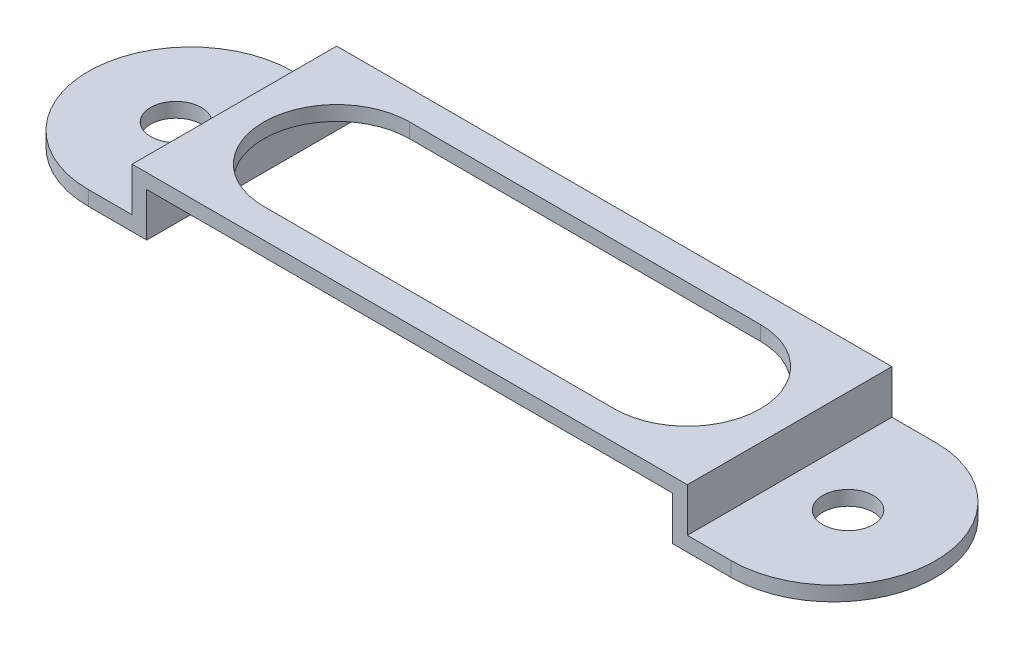
ISO-10303-21;
HEADER;
FILE_DESCRIPTION(('STEP AP214'),'2;1');
FILE_NAME('part.step','',(''),(''),'','','');
FILE_SCHEMA(('AUTOMOTIVE_DESIGN { 1 0 10303 214 1 1 1 1 }'));
ENDSEC;
DATA;
#1=APPLICATION_CONTEXT('core data for automotive mechanical design processes');
#2=APPLICATION_PROTOCOL_DEFINITION('international standard','automotive_design',2000,#1);
#3=PRODUCT_CONTEXT('',#1,'mechanical');
#4=PRODUCT('Part','Part','',(#3));
#5=PRODUCT_RELATED_PRODUCT_CATEGORY('part','',(#4));
#6=PRODUCT_DEFINITION_FORMATION('','',#4);
#7=PRODUCT_DEFINITION_CONTEXT('part definition',#1,'design');
#8=PRODUCT_DEFINITION('design','',#6,#7);
#9=PRODUCT_DEFINITION_SHAPE('','',#8);
#10=(LENGTH_UNIT() NAMED_UNIT(*) SI_UNIT(.MILLI.,.METRE.));
#11=(NAMED_UNIT(*) PLANE_ANGLE_UNIT() SI_UNIT($,.RADIAN.));
#12=(NAMED_UNIT(*) SI_UNIT($,.STERADIAN.) SOLID_ANGLE_UNIT());
#13=UNCERTAINTY_MEASURE_WITH_UNIT(LENGTH_MEASURE(1.E-05),#10,'distance_accuracy_value','');
#14=(GEOMETRIC_REPRESENTATION_CONTEXT(3) GLOBAL_UNCERTAINTY_ASSIGNED_CONTEXT((#13)) GLOBAL_UNIT_ASSIGNED_CONTEXT((#10,
#11,#12)) REPRESENTATION_CONTEXT('',''));
#15=CARTESIAN_POINT('',(0.,0.,0.));
#16=DIRECTION('',(0.,0.,1.));
#17=DIRECTION('',(1.,0.,0.));
#18=AXIS2_PLACEMENT_3D('',#15,#16,#17);
#19=CARTESIAN_POINT('',(0.,0.,0.));
#20=DIRECTION('',(0.,1.,0.));
#21=DIRECTION('',(0.,0.,1.));
#22=AXIS2_PLACEMENT_3D('',#19,#20,#21);
#23=PLANE('',#22);
#24=CARTESIAN_POINT('',(71.4375,0.,0.));
#25=DIRECTION('',(0.,1.,0.));
#26=DIRECTION('',(0.,0.,1.));
#27=AXIS2_PLACEMENT_3D('',#24,#25,#26);
#28=CIRCLE('',#27,2.75);
#29=CARTESIAN_POINT('',(71.4375,0.,2.75));
#30=VERTEX_POINT('',#29);
#31=EDGE_CURVE('E171',#30,#30,#28,.T.);
#32=ORIENTED_EDGE('',*,*,#31,.T.);
#33=EDGE_LOOP('',(#32));
#34=FACE_BOUND('',#33,.T.);
#35=DIRECTION('',(1.,0.,0.));
#36=VECTOR('',#35,1.);
#37=CARTESIAN_POINT('',(0.,0.,11.1125));
#38=LINE('',#37,#36);
#39=CARTESIAN_POINT('',(63.5,0.,11.1125));
#40=VERTEX_POINT('',#39);
#41=CARTESIAN_POINT('',(69.85,0.,11.1125));
#42=VERTEX_POINT('',#41);
#43=EDGE_CURVE('E253',#40,#42,#38,.T.);
#44=ORIENTED_EDGE('',*,*,#43,.F.);
#45=DIRECTION('',(0.,0.,-1.));
#46=VECTOR('',#45,1.);
#47=CARTESIAN_POINT('',(63.5,0.,11.1125));
#48=LINE('',#47,#46);
#49=CARTESIAN_POINT('',(63.5,0.,-11.1125));
#50=VERTEX_POINT('',#49);
#51=EDGE_CURVE('E205',#40,#50,#48,.T.);
#52=ORIENTED_EDGE('',*,*,#51,.T.);
#53=DIRECTION('',(-1.,0.,0.));
#54=VECTOR('',#53,1.);
#55=CARTESIAN_POINT('',(0.,0.,-11.1125));
#56=LINE('',#55,#54);
#57=CARTESIAN_POINT('',(69.85,0.,-11.1125));
#58=VERTEX_POINT('',#57);
#59=EDGE_CURVE('E247',#58,#50,#56,.T.);
#60=ORIENTED_EDGE('',*,*,#59,.F.);
#61=CARTESIAN_POINT('',(69.85,0.,0.));
#62=DIRECTION('',(0.,1.,0.));
#63=DIRECTION('',(0.,0.,1.));
#64=AXIS2_PLACEMENT_3D('',#61,#62,#63);
#65=CIRCLE('',#64,11.1125);
#66=EDGE_CURVE('E257',#42,#58,#65,.T.);
#67=ORIENTED_EDGE('',*,*,#66,.F.);
#68=EDGE_LOOP('',(#44,#52,#60,#67));
#69=FACE_BOUND('',#68,.T.);
#70=ADVANCED_FACE('F33',(#34,#69),#23,.F.);
#71=CARTESIAN_POINT('',(0.,6.35,0.));
#72=DIRECTION('',(0.,1.,0.));
#73=DIRECTION('',(0.,0.,1.));
#74=AXIS2_PLACEMENT_3D('',#71,#72,#73);
#75=PLANE('',#74);
#76=DIRECTION('',(0.,0.,-1.));
#77=VECTOR('',#76,1.);
#78=CARTESIAN_POINT('',(4.76249999999998,6.35,11.1125));
#79=LINE('',#78,#77);
#80=CARTESIAN_POINT('',(4.76249999999998,6.35,11.1125));
#81=VERTEX_POINT('',#80);
#82=CARTESIAN_POINT('',(4.76249999999999,6.35,-11.1125));
#83=VERTEX_POINT('',#82);
#84=EDGE_CURVE('E55',#81,#83,#79,.T.);
#85=ORIENTED_EDGE('',*,*,#84,.F.);
#86=DIRECTION('',(1.,0.,0.));
#87=VECTOR('',#86,1.);
#88=CARTESIAN_POINT('',(0.,6.35,11.1125));
#89=LINE('',#88,#87);
#90=CARTESIAN_POINT('',(65.0875,6.35,11.1125));
#91=VERTEX_POINT('',#90);
#92=EDGE_CURVE('E244',#81,#91,#89,.T.);
#93=ORIENTED_EDGE('',*,*,#92,.T.);
#94=DIRECTION('',(0.,0.,-1.));
#95=VECTOR('',#94,1.);
#96=CARTESIAN_POINT('',(65.0875,6.35,11.1125));
#97=LINE('',#96,#95);
#98=CARTESIAN_POINT('',(65.0875,6.35,-11.1125));
#99=VERTEX_POINT('',#98);
#100=EDGE_CURVE('E152',#91,#99,#97,.T.);
#101=ORIENTED_EDGE('',*,*,#100,.T.);
#102=DIRECTION('',(-1.,0.,0.));
#103=VECTOR('',#102,1.);
#104=CARTESIAN_POINT('',(0.,6.35,-11.1125));
#105=LINE('',#104,#103);
#106=EDGE_CURVE('E246',#99,#83,#105,.T.);
#107=ORIENTED_EDGE('',*,*,#106,.T.);
#108=EDGE_LOOP('',(#85,#93,#101,#107));
#109=FACE_BOUND('',#108,.T.);
#110=DIRECTION('',(1.,0.,0.));
#111=VECTOR('',#110,1.);
#112=CARTESIAN_POINT('',(15.875,6.35,7.9375));
#113=LINE('',#112,#111);
#114=CARTESIAN_POINT('',(15.875,6.35,7.9375));
#115=VERTEX_POINT('',#114);
#116=CARTESIAN_POINT('',(53.975,6.35,7.9375));
#117=VERTEX_POINT('',#116);
#118=EDGE_CURVE('E224',#115,#117,#113,.T.);
#119=ORIENTED_EDGE('',*,*,#118,.F.);
#120=CARTESIAN_POINT('',(15.875,6.35,0.));
#121=DIRECTION('',(0.,1.,0.));
#122=DIRECTION('',(0.,0.,1.));
#123=AXIS2_PLACEMENT_3D('',#120,#121,#122);
#124=CIRCLE('',#123,7.9375);
#125=CARTESIAN_POINT('',(15.875,6.35,-7.9375));
#126=VERTEX_POINT('',#125);
#127=EDGE_CURVE('E222',#126,#115,#124,.T.);
#128=ORIENTED_EDGE('',*,*,#127,.F.);
#129=DIRECTION('',(-1.,0.,0.));
#130=VECTOR('',#129,1.);
#131=CARTESIAN_POINT('',(15.875,6.35,-7.9375));
#132=LINE('',#131,#130);
#133=CARTESIAN_POINT('',(53.975,6.35,-7.93750000000001));
#134=VERTEX_POINT('',#133);
#135=EDGE_CURVE('E229',#134,#126,#132,.T.);
#136=ORIENTED_EDGE('',*,*,#135,.F.);
#137=CARTESIAN_POINT('',(53.975,6.35,0.));
#138=DIRECTION('',(0.,1.,0.));
#139=DIRECTION('',(0.,0.,1.));
#140=AXIS2_PLACEMENT_3D('',#137,#138,#139);
#141=CIRCLE('',#140,7.9375);
#142=EDGE_CURVE('E226',#117,#134,#141,.T.);
#143=ORIENTED_EDGE('',*,*,#142,.F.);
#144=EDGE_LOOP('',(#119,#128,#136,#143));
#145=FACE_BOUND('',#144,.T.);
#146=ADVANCED_FACE('F286',(#109,#145),#75,.T.);
#147=CARTESIAN_POINT('',(-1.5875,0.,0.));
#148=DIRECTION('',(0.,1.,0.));
#149=DIRECTION('',(0.,0.,1.));
#150=AXIS2_PLACEMENT_3D('',#147,#148,#149);
#151=CIRCLE('',#150,2.75);
#152=CARTESIAN_POINT('',(-1.5875,0.,2.75));
#153=VERTEX_POINT('',#152);
#154=EDGE_CURVE('E322',#153,#153,#151,.T.);
#155=ORIENTED_EDGE('',*,*,#154,.T.);
#156=EDGE_LOOP('',(#155));
#157=FACE_BOUND('',#156,.T.);
#158=CARTESIAN_POINT('',(6.34999999999999,0.,-11.1125));
#159=VERTEX_POINT('',#158);
#160=CARTESIAN_POINT('',(0.,0.,-11.1125));
#161=VERTEX_POINT('',#160);
#162=EDGE_CURVE('E260',#159,#161,#56,.T.);
#163=ORIENTED_EDGE('',*,*,#162,.F.);
#164=DIRECTION('',(0.,0.,-1.));
#165=VECTOR('',#164,1.);
#166=CARTESIAN_POINT('',(6.34999999999999,0.,11.1125));
#167=LINE('',#166,#165);
#168=CARTESIAN_POINT('',(6.34999999999999,0.,11.1125));
#169=VERTEX_POINT('',#168);
#170=EDGE_CURVE('E198',#169,#159,#167,.T.);
#171=ORIENTED_EDGE('',*,*,#170,.F.);
#172=CARTESIAN_POINT('',(0.,0.,11.1125));
#173=VERTEX_POINT('',#172);
#174=EDGE_CURVE('E254',#173,#169,#38,.T.);
#175=ORIENTED_EDGE('',*,*,#174,.F.);
#176=CARTESIAN_POINT('',(0.,0.,0.));
#177=DIRECTION('',(0.,1.,0.));
#178=DIRECTION('',(0.,0.,1.));
#179=AXIS2_PLACEMENT_3D('',#176,#177,#178);
#180=CIRCLE('',#179,11.1125);
#181=EDGE_CURVE('E243',#161,#173,#180,.T.);
#182=ORIENTED_EDGE('',*,*,#181,.F.);
#183=EDGE_LOOP('',(#163,#171,#175,#182));
#184=FACE_BOUND('',#183,.T.);
#185=ADVANCED_FACE('F304',(#157,#184),#23,.F.);
#186=CARTESIAN_POINT('',(0.,6.35,0.));
#187=DIRECTION('',(0.,-1.,0.));
#188=DIRECTION('',(0.,0.,-1.));
#189=AXIS2_PLACEMENT_3D('',#186,#187,#188);
#190=CYLINDRICAL_SURFACE('',#189,11.1125);
#191=DIRECTION('',(0.,-1.,0.));
#192=VECTOR('',#191,1.);
#193=CARTESIAN_POINT('',(0.,6.35,11.1125));
#194=LINE('',#193,#192);
#195=CARTESIAN_POINT('',(0.,1.5875,11.1125));
#196=VERTEX_POINT('',#195);
#197=EDGE_CURVE('E267',#196,#173,#194,.T.);
#198=ORIENTED_EDGE('',*,*,#197,.F.);
#199=CARTESIAN_POINT('',(0.,1.5875,0.));
#200=DIRECTION('',(0.,-1.,0.));
#201=DIRECTION('',(0.,0.,-1.));
#202=AXIS2_PLACEMENT_3D('',#199,#200,#201);
#203=CIRCLE('',#202,11.1125);
#204=CARTESIAN_POINT('',(0.,1.5875,-11.1125));
#205=VERTEX_POINT('',#204);
#206=EDGE_CURVE('E220',#196,#205,#203,.T.);
#207=ORIENTED_EDGE('',*,*,#206,.T.);
#208=DIRECTION('',(0.,-1.,0.));
#209=VECTOR('',#208,1.);
#210=CARTESIAN_POINT('',(0.,6.35,-11.1125));
#211=LINE('',#210,#209);
#212=EDGE_CURVE('E250',#205,#161,#211,.T.);
#213=ORIENTED_EDGE('',*,*,#212,.T.);
#214=ORIENTED_EDGE('',*,*,#181,.T.);
#215=EDGE_LOOP('',(#198,#207,#213,#214));
#216=FACE_BOUND('',#215,.T.);
#217=ADVANCED_FACE('F35',(#216),#190,.T.);
#218=CARTESIAN_POINT('',(0.,6.35,11.1125));
#219=DIRECTION('',(0.,0.,-1.));
#220=DIRECTION('',(-1.,0.,0.));
#221=AXIS2_PLACEMENT_3D('',#218,#219,#220);
#222=PLANE('',#221);
#223=DIRECTION('',(0.,-1.,0.));
#224=VECTOR('',#223,1.);
#225=CARTESIAN_POINT('',(4.76249999999998,6.35,11.1125));
#226=LINE('',#225,#224);
#227=CARTESIAN_POINT('',(4.76249999999999,1.5875,11.1125));
#228=VERTEX_POINT('',#227);
#229=EDGE_CURVE('E176',#81,#228,#226,.T.);
#230=ORIENTED_EDGE('',*,*,#229,.T.);
#231=DIRECTION('',(-1.,0.,0.));
#232=VECTOR('',#231,1.);
#233=CARTESIAN_POINT('',(4.76249999999999,1.5875,11.1125));
#234=LINE('',#233,#232);
#235=EDGE_CURVE('E178',#228,#196,#234,.T.);
#236=ORIENTED_EDGE('',*,*,#235,.T.);
#237=ORIENTED_EDGE('',*,*,#197,.T.);
#238=ORIENTED_EDGE('',*,*,#174,.T.);
#239=DIRECTION('',(0.,1.,0.));
#240=VECTOR('',#239,1.);
#241=CARTESIAN_POINT('',(6.34999999999999,0.,11.1125));
#242=LINE('',#241,#240);
#243=CARTESIAN_POINT('',(6.34999999999999,4.7625,11.1125));
#244=VERTEX_POINT('',#243);
#245=EDGE_CURVE('E188',#169,#244,#242,.T.);
#246=ORIENTED_EDGE('',*,*,#245,.T.);
#247=DIRECTION('',(1.,0.,0.));
#248=VECTOR('',#247,1.);
#249=CARTESIAN_POINT('',(6.34999999999999,4.7625,11.1125));
#250=LINE('',#249,#248);
#251=CARTESIAN_POINT('',(63.5,4.76249999999999,11.1125));
#252=VERTEX_POINT('',#251);
#253=EDGE_CURVE('E191',#244,#252,#250,.T.);
#254=ORIENTED_EDGE('',*,*,#253,.T.);
#255=DIRECTION('',(0.,-1.,0.));
#256=VECTOR('',#255,1.);
#257=CARTESIAN_POINT('',(63.5,4.76249999999999,11.1125));
#258=LINE('',#257,#256);
#259=EDGE_CURVE('E195',#252,#40,#258,.T.);
#260=ORIENTED_EDGE('',*,*,#259,.T.);
#261=ORIENTED_EDGE('',*,*,#43,.T.);
#262=DIRECTION('',(0.,-1.,0.));
#263=VECTOR('',#262,1.);
#264=CARTESIAN_POINT('',(69.85,6.35,11.1125));
#265=LINE('',#264,#263);
#266=CARTESIAN_POINT('',(69.85,1.5875,11.1125));
#267=VERTEX_POINT('',#266);
#268=EDGE_CURVE('E165',#267,#42,#265,.T.);
#269=ORIENTED_EDGE('',*,*,#268,.F.);
#270=DIRECTION('',(-1.,0.,0.));
#271=VECTOR('',#270,1.);
#272=CARTESIAN_POINT('',(80.9625,1.5875,11.1125));
#273=LINE('',#272,#271);
#274=CARTESIAN_POINT('',(65.0875,1.5875,11.1125));
#275=VERTEX_POINT('',#274);
#276=EDGE_CURVE('E148',#267,#275,#273,.T.);
#277=ORIENTED_EDGE('',*,*,#276,.T.);
#278=DIRECTION('',(0.,1.,0.));
#279=VECTOR('',#278,1.);
#280=CARTESIAN_POINT('',(65.0875,1.5875,11.1125));
#281=LINE('',#280,#279);
#282=EDGE_CURVE('E153',#275,#91,#281,.T.);
#283=ORIENTED_EDGE('',*,*,#282,.T.);
#284=ORIENTED_EDGE('',*,*,#92,.F.);
#285=EDGE_LOOP('',(#230,#236,#237,#238,#246,#254,#260,#261,#269,#277,#283,#284));
#286=FACE_BOUND('',#285,.T.);
#287=ADVANCED_FACE('F163',(#286),#222,.F.);
#288=CARTESIAN_POINT('',(69.85,6.35,0.));
#289=DIRECTION('',(0.,-1.,0.));
#290=DIRECTION('',(0.,0.,-1.));
#291=AXIS2_PLACEMENT_3D('',#288,#289,#290);
#292=CYLINDRICAL_SURFACE('',#291,11.1125);
#293=CARTESIAN_POINT('',(69.85,1.5875,0.));
#294=DIRECTION('',(0.,-1.,0.));
#295=DIRECTION('',(1.,0.,0.));
#296=AXIS2_PLACEMENT_3D('',#293,#294,#295);
#297=CIRCLE('',#296,11.1125);
#298=CARTESIAN_POINT('',(69.85,1.5875,-11.1125));
#299=VERTEX_POINT('',#298);
#300=EDGE_CURVE('E48',#299,#267,#297,.T.);
#301=ORIENTED_EDGE('',*,*,#300,.T.);
#302=ORIENTED_EDGE('',*,*,#268,.T.);
#303=ORIENTED_EDGE('',*,*,#66,.T.);
#304=DIRECTION('',(0.,-1.,0.));
#305=VECTOR('',#304,1.);
#306=CARTESIAN_POINT('',(69.85,6.35,-11.1125));
#307=LINE('',#306,#305);
#308=EDGE_CURVE('E264',#299,#58,#307,.T.);
#309=ORIENTED_EDGE('',*,*,#308,.F.);
#310=EDGE_LOOP('',(#301,#302,#303,#309));
#311=FACE_BOUND('',#310,.T.);
#312=ADVANCED_FACE('F471',(#311),#292,.T.);
#313=CARTESIAN_POINT('',(0.,6.35,-11.1125));
#314=DIRECTION('',(0.,0.,1.));
#315=DIRECTION('',(1.,0.,0.));
#316=AXIS2_PLACEMENT_3D('',#313,#314,#315);
#317=PLANE('',#316);
#318=ORIENTED_EDGE('',*,*,#212,.F.);
#319=DIRECTION('',(-1.,0.,0.));
#320=VECTOR('',#319,1.);
#321=CARTESIAN_POINT('',(4.76249999999999,1.5875,-11.1125));
#322=LINE('',#321,#320);
#323=CARTESIAN_POINT('',(4.76249999999999,1.5875,-11.1125));
#324=VERTEX_POINT('',#323);
#325=EDGE_CURVE('E179',#324,#205,#322,.T.);
#326=ORIENTED_EDGE('',*,*,#325,.F.);
#327=DIRECTION('',(0.,-1.,0.));
#328=VECTOR('',#327,1.);
#329=CARTESIAN_POINT('',(4.76249999999998,6.35,-11.1125));
#330=LINE('',#329,#328);
#331=EDGE_CURVE('E182',#83,#324,#330,.T.);
#332=ORIENTED_EDGE('',*,*,#331,.F.);
#333=ORIENTED_EDGE('',*,*,#106,.F.);
#334=DIRECTION('',(0.,1.,0.));
#335=VECTOR('',#334,1.);
#336=CARTESIAN_POINT('',(65.0875,1.5875,-11.1125));
#337=LINE('',#336,#335);
#338=CARTESIAN_POINT('',(65.0875,1.5875,-11.1125));
#339=VERTEX_POINT('',#338);
#340=EDGE_CURVE('E166',#339,#99,#337,.T.);
#341=ORIENTED_EDGE('',*,*,#340,.F.);
#342=DIRECTION('',(1.,0.,0.));
#343=VECTOR('',#342,1.);
#344=CARTESIAN_POINT('',(0.,1.5875,-11.1125));
#345=LINE('',#344,#343);
#346=EDGE_CURVE('E11',#339,#299,#345,.T.);
#347=ORIENTED_EDGE('',*,*,#346,.T.);
#348=ORIENTED_EDGE('',*,*,#308,.T.);
#349=ORIENTED_EDGE('',*,*,#59,.T.);
#350=DIRECTION('',(0.,-1.,0.));
#351=VECTOR('',#350,1.);
#352=CARTESIAN_POINT('',(63.5,4.76249999999999,-11.1125));
#353=LINE('',#352,#351);
#354=CARTESIAN_POINT('',(63.5,4.76249999999999,-11.1125));
#355=VERTEX_POINT('',#354);
#356=EDGE_CURVE('E192',#355,#50,#353,.T.);
#357=ORIENTED_EDGE('',*,*,#356,.F.);
#358=DIRECTION('',(1.,0.,0.));
#359=VECTOR('',#358,1.);
#360=CARTESIAN_POINT('',(6.34999999999999,4.7625,-11.1125));
#361=LINE('',#360,#359);
#362=CARTESIAN_POINT('',(6.34999999999999,4.7625,-11.1125));
#363=VERTEX_POINT('',#362);
#364=EDGE_CURVE('E201',#363,#355,#361,.T.);
#365=ORIENTED_EDGE('',*,*,#364,.F.);
#366=DIRECTION('',(0.,1.,0.));
#367=VECTOR('',#366,1.);
#368=CARTESIAN_POINT('',(6.34999999999999,0.,-11.1125));
#369=LINE('',#368,#367);
#370=EDGE_CURVE('E174',#159,#363,#369,.T.);
#371=ORIENTED_EDGE('',*,*,#370,.F.);
#372=ORIENTED_EDGE('',*,*,#162,.T.);
#373=EDGE_LOOP('',(#318,#326,#332,#333,#341,#347,#348,#349,#357,#365,#371,#372));
#374=FACE_BOUND('',#373,.T.);
#375=ADVANCED_FACE('F331',(#374),#317,.F.);
#376=CARTESIAN_POINT('',(15.875,6.35,0.));
#377=DIRECTION('',(0.,-1.,0.));
#378=DIRECTION('',(0.,0.,-1.));
#379=AXIS2_PLACEMENT_3D('',#376,#377,#378);
#380=CYLINDRICAL_SURFACE('',#379,7.9375);
#381=CARTESIAN_POINT('',(15.875,4.7625,0.));
#382=DIRECTION('',(0.,1.,0.));
#383=DIRECTION('',(-1.,0.,0.));
#384=AXIS2_PLACEMENT_3D('',#381,#382,#383);
#385=CIRCLE('',#384,7.9375);
#386=CARTESIAN_POINT('',(15.875,4.7625,-7.9375));
#387=VERTEX_POINT('',#386);
#388=CARTESIAN_POINT('',(15.875,4.7625,7.9375));
#389=VERTEX_POINT('',#388);
#390=EDGE_CURVE('E217',#387,#389,#385,.T.);
#391=ORIENTED_EDGE('',*,*,#390,.F.);
#392=DIRECTION('',(0.,-1.,0.));
#393=VECTOR('',#392,1.);
#394=CARTESIAN_POINT('',(15.875,6.35,-7.9375));
#395=LINE('',#394,#393);
#396=EDGE_CURVE('E231',#126,#387,#395,.T.);
#397=ORIENTED_EDGE('',*,*,#396,.F.);
#398=ORIENTED_EDGE('',*,*,#127,.T.);
#399=DIRECTION('',(0.,-1.,0.));
#400=VECTOR('',#399,1.);
#401=CARTESIAN_POINT('',(15.875,6.35,7.9375));
#402=LINE('',#401,#400);
#403=EDGE_CURVE('E240',#115,#389,#402,.T.);
#404=ORIENTED_EDGE('',*,*,#403,.T.);
#405=EDGE_LOOP('',(#391,#397,#398,#404));
#406=FACE_BOUND('',#405,.T.);
#407=ADVANCED_FACE('F278',(#406),#380,.F.);
#408=CARTESIAN_POINT('',(15.875,6.35,7.9375));
#409=DIRECTION('',(0.,0.,-1.));
#410=DIRECTION('',(-1.,0.,0.));
#411=AXIS2_PLACEMENT_3D('',#408,#409,#410);
#412=PLANE('',#411);
#413=DIRECTION('',(1.,0.,0.));
#414=VECTOR('',#413,1.);
#415=CARTESIAN_POINT('',(15.875,4.7625,7.9375));
#416=LINE('',#415,#414);
#417=CARTESIAN_POINT('',(53.975,4.76249999999999,7.9375));
#418=VERTEX_POINT('',#417);
#419=EDGE_CURVE('E215',#389,#418,#416,.T.);
#420=ORIENTED_EDGE('',*,*,#419,.F.);
#421=ORIENTED_EDGE('',*,*,#403,.F.);
#422=ORIENTED_EDGE('',*,*,#118,.T.);
#423=DIRECTION('',(0.,-1.,0.));
#424=VECTOR('',#423,1.);
#425=CARTESIAN_POINT('',(53.975,6.35,7.9375));
#426=LINE('',#425,#424);
#427=EDGE_CURVE('E237',#117,#418,#426,.T.);
#428=ORIENTED_EDGE('',*,*,#427,.T.);
#429=EDGE_LOOP('',(#420,#421,#422,#428));
#430=FACE_BOUND('',#429,.T.);
#431=ADVANCED_FACE('F288',(#430),#412,.T.);
#432=CARTESIAN_POINT('',(53.975,6.35,0.));
#433=DIRECTION('',(0.,-1.,0.));
#434=DIRECTION('',(0.,0.,-1.));
#435=AXIS2_PLACEMENT_3D('',#432,#433,#434);
#436=CYLINDRICAL_SURFACE('',#435,7.9375);
#437=CARTESIAN_POINT('',(53.975,4.76249999999999,0.));
#438=DIRECTION('',(0.,1.,0.));
#439=DIRECTION('',(-1.,0.,0.));
#440=AXIS2_PLACEMENT_3D('',#437,#438,#439);
#441=CIRCLE('',#440,7.9375);
#442=CARTESIAN_POINT('',(53.975,4.7625,-7.93750000000001));
#443=VERTEX_POINT('',#442);
#444=EDGE_CURVE('E208',#418,#443,#441,.T.);
#445=ORIENTED_EDGE('',*,*,#444,.F.);
#446=ORIENTED_EDGE('',*,*,#427,.F.);
#447=ORIENTED_EDGE('',*,*,#142,.T.);
#448=DIRECTION('',(0.,-1.,0.));
#449=VECTOR('',#448,1.);
#450=CARTESIAN_POINT('',(53.975,6.35,-7.93750000000001));
#451=LINE('',#450,#449);
#452=EDGE_CURVE('E234',#134,#443,#451,.T.);
#453=ORIENTED_EDGE('',*,*,#452,.T.);
#454=EDGE_LOOP('',(#445,#446,#447,#453));
#455=FACE_BOUND('',#454,.T.);
#456=ADVANCED_FACE('F291',(#455),#436,.F.);
#457=CARTESIAN_POINT('',(15.875,6.35,-7.9375));
#458=DIRECTION('',(0.,0.,1.));
#459=DIRECTION('',(1.,0.,0.));
#460=AXIS2_PLACEMENT_3D('',#457,#458,#459);
#461=PLANE('',#460);
#462=DIRECTION('',(-1.,0.,0.));
#463=VECTOR('',#462,1.);
#464=CARTESIAN_POINT('',(15.875,4.7625,-7.9375));
#465=LINE('',#464,#463);
#466=EDGE_CURVE('E41',#443,#387,#465,.T.);
#467=ORIENTED_EDGE('',*,*,#466,.F.);
#468=ORIENTED_EDGE('',*,*,#452,.F.);
#469=ORIENTED_EDGE('',*,*,#135,.T.);
#470=ORIENTED_EDGE('',*,*,#396,.T.);
#471=EDGE_LOOP('',(#467,#468,#469,#470));
#472=FACE_BOUND('',#471,.T.);
#473=ADVANCED_FACE('F281',(#472),#461,.T.);
#474=CARTESIAN_POINT('',(63.5,4.76249999999999,11.1125));
#475=DIRECTION('',(1.,0.,0.));
#476=DIRECTION('',(0.,0.,-1.));
#477=AXIS2_PLACEMENT_3D('',#474,#475,#476);
#478=PLANE('',#477);
#479=ORIENTED_EDGE('',*,*,#356,.T.);
#480=ORIENTED_EDGE('',*,*,#51,.F.);
#481=ORIENTED_EDGE('',*,*,#259,.F.);
#482=DIRECTION('',(0.,0.,-1.));
#483=VECTOR('',#482,1.);
#484=CARTESIAN_POINT('',(63.5,4.76249999999999,11.1125));
#485=LINE('',#484,#483);
#486=EDGE_CURVE('E209',#252,#355,#485,.T.);
#487=ORIENTED_EDGE('',*,*,#486,.T.);
#488=EDGE_LOOP('',(#479,#480,#481,#487));
#489=FACE_BOUND('',#488,.T.);
#490=ADVANCED_FACE('F298',(#489),#478,.F.);
#491=CARTESIAN_POINT('',(6.34999999999999,4.7625,11.1125));
#492=DIRECTION('',(0.,1.,0.));
#493=DIRECTION('',(-1.,0.,0.));
#494=AXIS2_PLACEMENT_3D('',#491,#492,#493);
#495=PLANE('',#494);
#496=ORIENTED_EDGE('',*,*,#390,.T.);
#497=ORIENTED_EDGE('',*,*,#419,.T.);
#498=ORIENTED_EDGE('',*,*,#444,.T.);
#499=ORIENTED_EDGE('',*,*,#466,.T.);
#500=EDGE_LOOP('',(#496,#497,#498,#499));
#501=FACE_BOUND('',#500,.T.);
#502=ORIENTED_EDGE('',*,*,#364,.T.);
#503=ORIENTED_EDGE('',*,*,#486,.F.);
#504=ORIENTED_EDGE('',*,*,#253,.F.);
#505=DIRECTION('',(0.,0.,-1.));
#506=VECTOR('',#505,1.);
#507=CARTESIAN_POINT('',(6.34999999999999,4.7625,11.1125));
#508=LINE('',#507,#506);
#509=EDGE_CURVE('E211',#244,#363,#508,.T.);
#510=ORIENTED_EDGE('',*,*,#509,.T.);
#511=EDGE_LOOP('',(#502,#503,#504,#510));
#512=FACE_BOUND('',#511,.T.);
#513=ADVANCED_FACE('F271',(#501,#512),#495,.F.);
#514=CARTESIAN_POINT('',(6.34999999999999,0.,11.1125));
#515=DIRECTION('',(-1.,0.,0.));
#516=DIRECTION('',(0.,0.,1.));
#517=AXIS2_PLACEMENT_3D('',#514,#515,#516);
#518=PLANE('',#517);
#519=ORIENTED_EDGE('',*,*,#370,.T.);
#520=ORIENTED_EDGE('',*,*,#509,.F.);
#521=ORIENTED_EDGE('',*,*,#245,.F.);
#522=ORIENTED_EDGE('',*,*,#170,.T.);
#523=EDGE_LOOP('',(#519,#520,#521,#522));
#524=FACE_BOUND('',#523,.T.);
#525=ADVANCED_FACE('F336',(#524),#518,.F.);
#526=CARTESIAN_POINT('',(80.9625,1.5875,11.1125));
#527=DIRECTION('',(0.,-1.,0.));
#528=DIRECTION('',(1.,0.,0.));
#529=AXIS2_PLACEMENT_3D('',#526,#527,#528);
#530=PLANE('',#529);
#531=CARTESIAN_POINT('',(71.4375,1.5875,0.));
#532=DIRECTION('',(0.,1.,0.));
#533=DIRECTION('',(0.,0.,1.));
#534=AXIS2_PLACEMENT_3D('',#531,#532,#533);
#535=CIRCLE('',#534,2.74999999999999);
#536=CARTESIAN_POINT('',(71.4375,1.5875,2.74999999999999));
#537=VERTEX_POINT('',#536);
#538=EDGE_CURVE('E383',#537,#537,#535,.T.);
#539=ORIENTED_EDGE('',*,*,#538,.F.);
#540=EDGE_LOOP('',(#539));
#541=FACE_BOUND('',#540,.T.);
#542=ORIENTED_EDGE('',*,*,#300,.F.);
#543=ORIENTED_EDGE('',*,*,#346,.F.);
#544=DIRECTION('',(0.,0.,-1.));
#545=VECTOR('',#544,1.);
#546=CARTESIAN_POINT('',(65.0875,1.5875,11.1125));
#547=LINE('',#546,#545);
#548=EDGE_CURVE('E144',#275,#339,#547,.T.);
#549=ORIENTED_EDGE('',*,*,#548,.F.);
#550=ORIENTED_EDGE('',*,*,#276,.F.);
#551=EDGE_LOOP('',(#542,#543,#549,#550));
#552=FACE_BOUND('',#551,.T.);
#553=ADVANCED_FACE('F146',(#541,#552),#530,.F.);
#554=CARTESIAN_POINT('',(65.0875,1.5875,11.1125));
#555=DIRECTION('',(-1.,0.,0.));
#556=DIRECTION('',(0.,0.,1.));
#557=AXIS2_PLACEMENT_3D('',#554,#555,#556);
#558=PLANE('',#557);
#559=ORIENTED_EDGE('',*,*,#340,.T.);
#560=ORIENTED_EDGE('',*,*,#100,.F.);
#561=ORIENTED_EDGE('',*,*,#282,.F.);
#562=ORIENTED_EDGE('',*,*,#548,.T.);
#563=EDGE_LOOP('',(#559,#560,#561,#562));
#564=FACE_BOUND('',#563,.T.);
#565=ADVANCED_FACE('F156',(#564),#558,.F.);
#566=CARTESIAN_POINT('',(4.76249999999999,1.5875,11.1125));
#567=DIRECTION('',(0.,-1.,0.));
#568=DIRECTION('',(0.,0.,-1.));
#569=AXIS2_PLACEMENT_3D('',#566,#567,#568);
#570=PLANE('',#569);
#571=CARTESIAN_POINT('',(-1.5875,1.5875,0.));
#572=DIRECTION('',(0.,1.,0.));
#573=DIRECTION('',(0.,0.,1.));
#574=AXIS2_PLACEMENT_3D('',#571,#572,#573);
#575=CIRCLE('',#574,2.74999999999999);
#576=CARTESIAN_POINT('',(-1.5875,1.5875,2.74999999999999));
#577=VERTEX_POINT('',#576);
#578=EDGE_CURVE('E381',#577,#577,#575,.T.);
#579=ORIENTED_EDGE('',*,*,#578,.F.);
#580=EDGE_LOOP('',(#579));
#581=FACE_BOUND('',#580,.T.);
#582=ORIENTED_EDGE('',*,*,#235,.F.);
#583=DIRECTION('',(0.,0.,-1.));
#584=VECTOR('',#583,1.);
#585=CARTESIAN_POINT('',(4.76249999999999,1.5875,11.1125));
#586=LINE('',#585,#584);
#587=EDGE_CURVE('E168',#228,#324,#586,.T.);
#588=ORIENTED_EDGE('',*,*,#587,.T.);
#589=ORIENTED_EDGE('',*,*,#325,.T.);
#590=ORIENTED_EDGE('',*,*,#206,.F.);
#591=EDGE_LOOP('',(#582,#588,#589,#590));
#592=FACE_BOUND('',#591,.T.);
#593=ADVANCED_FACE('F341',(#581,#592),#570,.F.);
#594=CARTESIAN_POINT('',(4.76249999999998,6.35,11.1125));
#595=DIRECTION('',(1.,0.,0.));
#596=DIRECTION('',(0.,1.,0.));
#597=AXIS2_PLACEMENT_3D('',#594,#595,#596);
#598=PLANE('',#597);
#599=ORIENTED_EDGE('',*,*,#331,.T.);
#600=ORIENTED_EDGE('',*,*,#587,.F.);
#601=ORIENTED_EDGE('',*,*,#229,.F.);
#602=ORIENTED_EDGE('',*,*,#84,.T.);
#603=EDGE_LOOP('',(#599,#600,#601,#602));
#604=FACE_BOUND('',#603,.T.);
#605=ADVANCED_FACE('F343',(#604),#598,.F.);
#606=CARTESIAN_POINT('',(71.4375,1.5875,0.));
#607=DIRECTION('',(0.,1.,0.));
#608=DIRECTION('',(0.,0.,1.));
#609=AXIS2_PLACEMENT_3D('',#606,#607,#608);
#610=CYLINDRICAL_SURFACE('',#609,2.75);
#611=ORIENTED_EDGE('',*,*,#31,.F.);
#612=EDGE_LOOP('',(#611));
#613=FACE_BOUND('',#612,.T.);
#614=ORIENTED_EDGE('',*,*,#538,.T.);
#615=EDGE_LOOP('',(#614));
#616=FACE_BOUND('',#615,.T.);
#617=ADVANCED_FACE('F345',(#613,#616),#610,.F.);
#618=CARTESIAN_POINT('',(-1.5875,1.5875,0.));
#619=DIRECTION('',(0.,1.,0.));
#620=DIRECTION('',(0.,0.,1.));
#621=AXIS2_PLACEMENT_3D('',#618,#619,#620);
#622=CYLINDRICAL_SURFACE('',#621,2.74999999999999);
#623=ORIENTED_EDGE('',*,*,#154,.F.);
#624=EDGE_LOOP('',(#623));
#625=FACE_BOUND('',#624,.T.);
#626=ORIENTED_EDGE('',*,*,#578,.T.);
#627=EDGE_LOOP('',(#626));
#628=FACE_BOUND('',#627,.T.);
#629=ADVANCED_FACE('F351',(#625,#628),#622,.F.);
#630=CLOSED_SHELL('',(#70,#146,#185,#217,#287,#312,#375,#407,#431,#456,#473,#490,#513,#525,#553,
#565,#593,#605,#617,#629));
#631=MANIFOLD_SOLID_BREP('B2',#630);
#632=ADVANCED_BREP_SHAPE_REPRESENTATION('',(#18,#631),#14);
#633=SHAPE_DEFINITION_REPRESENTATION(#9,#632);
ENDSEC;
END-ISO-10303-21;
